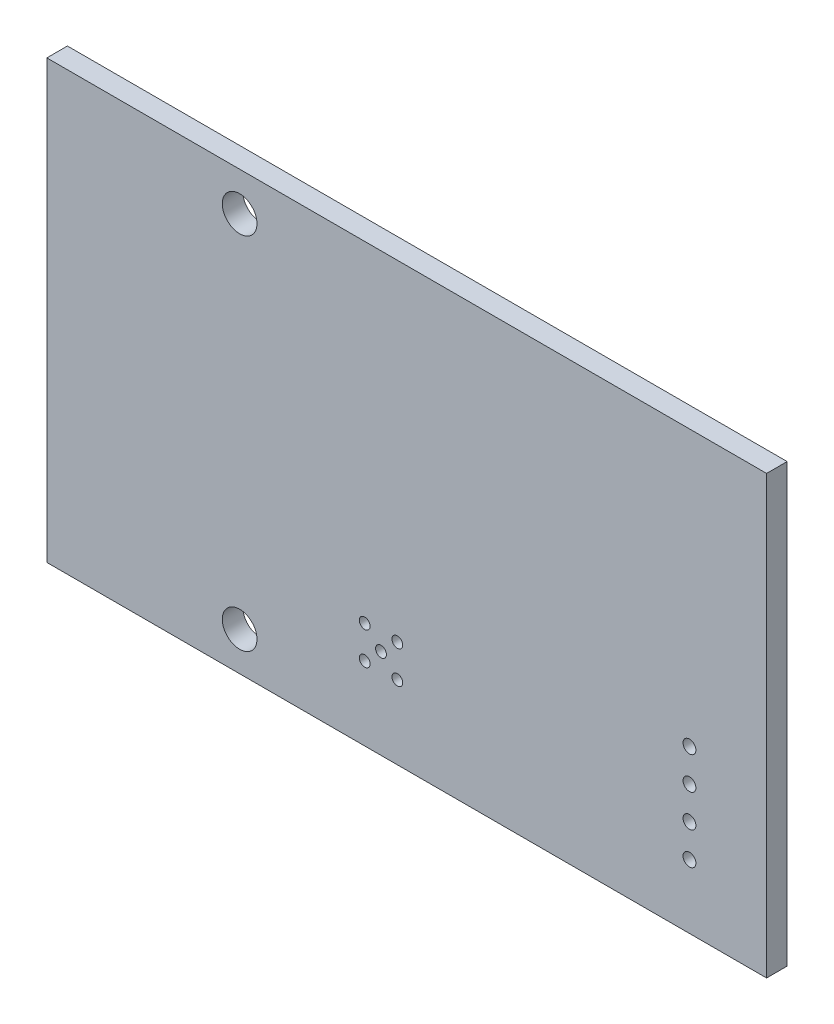
ISO-10303-21;
HEADER;
FILE_DESCRIPTION(('STEP AP214'),'2;1');
FILE_NAME('part.step','',(''),(''),'','','');
FILE_SCHEMA(('AUTOMOTIVE_DESIGN { 1 0 10303 214 1 1 1 1 }'));
ENDSEC;
DATA;
#1=APPLICATION_CONTEXT('core data for automotive mechanical design processes');
#2=APPLICATION_PROTOCOL_DEFINITION('international standard','automotive_design',2000,#1);
#3=PRODUCT_CONTEXT('',#1,'mechanical');
#4=PRODUCT('Part','Part','',(#3));
#5=PRODUCT_RELATED_PRODUCT_CATEGORY('part','',(#4));
#6=PRODUCT_DEFINITION_FORMATION('','',#4);
#7=PRODUCT_DEFINITION_CONTEXT('part definition',#1,'design');
#8=PRODUCT_DEFINITION('design','',#6,#7);
#9=PRODUCT_DEFINITION_SHAPE('','',#8);
#10=(LENGTH_UNIT() NAMED_UNIT(*) SI_UNIT(.MILLI.,.METRE.));
#11=(NAMED_UNIT(*) PLANE_ANGLE_UNIT() SI_UNIT($,.RADIAN.));
#12=(NAMED_UNIT(*) SI_UNIT($,.STERADIAN.) SOLID_ANGLE_UNIT());
#13=UNCERTAINTY_MEASURE_WITH_UNIT(LENGTH_MEASURE(1.E-05),#10,'distance_accuracy_value','');
#14=(GEOMETRIC_REPRESENTATION_CONTEXT(3) GLOBAL_UNCERTAINTY_ASSIGNED_CONTEXT((#13)) GLOBAL_UNIT_ASSIGNED_CONTEXT((#10,
#11,#12)) REPRESENTATION_CONTEXT('',''));
#15=CARTESIAN_POINT('',(0.,0.,0.));
#16=DIRECTION('',(0.,0.,1.));
#17=DIRECTION('',(1.,0.,0.));
#18=AXIS2_PLACEMENT_3D('',#15,#16,#17);
#19=CARTESIAN_POINT('',(103.,-63.,-0.8));
#20=DIRECTION('',(0.,0.,1.));
#21=DIRECTION('',(1.,0.,0.));
#22=AXIS2_PLACEMENT_3D('',#19,#20,#21);
#23=CYLINDRICAL_SURFACE('',#22,1.35);
#24=DIRECTION('',(0.,0.,1.));
#25=VECTOR('',#24,1.);
#26=CARTESIAN_POINT('',(104.35,-63.,-0.8));
#27=LINE('',#26,#25);
#28=CARTESIAN_POINT('',(104.35,-63.,0.));
#29=VERTEX_POINT('',#28);
#30=CARTESIAN_POINT('',(104.35,-63.,1.6));
#31=VERTEX_POINT('',#30);
#32=EDGE_CURVE('E11',#29,#31,#27,.T.);
#33=ORIENTED_EDGE('',*,*,#32,.F.);
#34=CARTESIAN_POINT('',(103.,-63.,0.));
#35=DIRECTION('',(0.,0.,1.));
#36=DIRECTION('',(1.,0.,0.));
#37=AXIS2_PLACEMENT_3D('',#34,#35,#36);
#38=CIRCLE('',#37,1.35);
#39=EDGE_CURVE('E218',#29,#29,#38,.T.);
#40=ORIENTED_EDGE('',*,*,#39,.F.);
#41=ORIENTED_EDGE('',*,*,#32,.T.);
#42=CARTESIAN_POINT('',(103.,-63.,1.6));
#43=DIRECTION('',(0.,0.,1.));
#44=DIRECTION('',(1.,0.,0.));
#45=AXIS2_PLACEMENT_3D('',#42,#43,#44);
#46=CIRCLE('',#45,1.35);
#47=EDGE_CURVE('E312',#31,#31,#46,.T.);
#48=ORIENTED_EDGE('',*,*,#47,.T.);
#49=EDGE_LOOP('',(#33,#40,#41,#48));
#50=FACE_BOUND('',#49,.T.);
#51=ADVANCED_FACE('F16',(#50),#23,.F.);
#52=CARTESIAN_POINT('',(138.,-81.4,-0.8));
#53=DIRECTION('',(0.,0.,1.));
#54=DIRECTION('',(1.,0.,0.));
#55=AXIS2_PLACEMENT_3D('',#52,#53,#54);
#56=CYLINDRICAL_SURFACE('',#55,0.5);
#57=DIRECTION('',(0.,0.,1.));
#58=VECTOR('',#57,1.);
#59=CARTESIAN_POINT('',(138.5,-81.4,-0.8));
#60=LINE('',#59,#58);
#61=CARTESIAN_POINT('',(138.5,-81.4,0.));
#62=VERTEX_POINT('',#61);
#63=CARTESIAN_POINT('',(138.5,-81.4,1.6));
#64=VERTEX_POINT('',#63);
#65=EDGE_CURVE('E27',#62,#64,#60,.T.);
#66=ORIENTED_EDGE('',*,*,#65,.F.);
#67=CARTESIAN_POINT('',(138.,-81.4,0.));
#68=DIRECTION('',(0.,0.,1.));
#69=DIRECTION('',(1.,0.,0.));
#70=AXIS2_PLACEMENT_3D('',#67,#68,#69);
#71=CIRCLE('',#70,0.5);
#72=EDGE_CURVE('E222',#62,#62,#71,.T.);
#73=ORIENTED_EDGE('',*,*,#72,.F.);
#74=ORIENTED_EDGE('',*,*,#65,.T.);
#75=CARTESIAN_POINT('',(138.,-81.4,1.6));
#76=DIRECTION('',(0.,0.,1.));
#77=DIRECTION('',(1.,0.,0.));
#78=AXIS2_PLACEMENT_3D('',#75,#76,#77);
#79=CIRCLE('',#78,0.5);
#80=EDGE_CURVE('E246',#64,#64,#79,.T.);
#81=ORIENTED_EDGE('',*,*,#80,.T.);
#82=EDGE_LOOP('',(#66,#73,#74,#81));
#83=FACE_BOUND('',#82,.T.);
#84=ADVANCED_FACE('F321',(#83),#56,.F.);
#85=CARTESIAN_POINT('',(138.,-83.94,-0.8));
#86=DIRECTION('',(0.,0.,1.));
#87=DIRECTION('',(1.,0.,0.));
#88=AXIS2_PLACEMENT_3D('',#85,#86,#87);
#89=CYLINDRICAL_SURFACE('',#88,0.5);
#90=DIRECTION('',(0.,0.,1.));
#91=VECTOR('',#90,1.);
#92=CARTESIAN_POINT('',(138.5,-83.94,-0.8));
#93=LINE('',#92,#91);
#94=CARTESIAN_POINT('',(138.5,-83.94,0.));
#95=VERTEX_POINT('',#94);
#96=CARTESIAN_POINT('',(138.5,-83.94,1.6));
#97=VERTEX_POINT('',#96);
#98=EDGE_CURVE('E178',#95,#97,#93,.T.);
#99=ORIENTED_EDGE('',*,*,#98,.F.);
#100=CARTESIAN_POINT('',(138.,-83.94,0.));
#101=DIRECTION('',(0.,0.,1.));
#102=DIRECTION('',(1.,0.,0.));
#103=AXIS2_PLACEMENT_3D('',#100,#101,#102);
#104=CIRCLE('',#103,0.5);
#105=EDGE_CURVE('E217',#95,#95,#104,.T.);
#106=ORIENTED_EDGE('',*,*,#105,.F.);
#107=ORIENTED_EDGE('',*,*,#98,.T.);
#108=CARTESIAN_POINT('',(138.,-83.94,1.6));
#109=DIRECTION('',(0.,0.,1.));
#110=DIRECTION('',(1.,0.,0.));
#111=AXIS2_PLACEMENT_3D('',#108,#109,#110);
#112=CIRCLE('',#111,0.5);
#113=EDGE_CURVE('E184',#97,#97,#112,.T.);
#114=ORIENTED_EDGE('',*,*,#113,.T.);
#115=EDGE_LOOP('',(#99,#106,#107,#114));
#116=FACE_BOUND('',#115,.T.);
#117=ADVANCED_FACE('F380',(#116),#89,.F.);
#118=CARTESIAN_POINT('',(138.,-86.48,-0.8));
#119=DIRECTION('',(0.,0.,1.));
#120=DIRECTION('',(1.,0.,0.));
#121=AXIS2_PLACEMENT_3D('',#118,#119,#120);
#122=CYLINDRICAL_SURFACE('',#121,0.5);
#123=DIRECTION('',(0.,0.,1.));
#124=VECTOR('',#123,1.);
#125=CARTESIAN_POINT('',(138.5,-86.48,-0.8));
#126=LINE('',#125,#124);
#127=CARTESIAN_POINT('',(138.5,-86.48,0.));
#128=VERTEX_POINT('',#127);
#129=CARTESIAN_POINT('',(138.5,-86.48,1.6));
#130=VERTEX_POINT('',#129);
#131=EDGE_CURVE('E20',#128,#130,#126,.T.);
#132=ORIENTED_EDGE('',*,*,#131,.F.);
#133=CARTESIAN_POINT('',(138.,-86.48,0.));
#134=DIRECTION('',(0.,0.,1.));
#135=DIRECTION('',(1.,0.,0.));
#136=AXIS2_PLACEMENT_3D('',#133,#134,#135);
#137=CIRCLE('',#136,0.5);
#138=EDGE_CURVE('E213',#128,#128,#137,.T.);
#139=ORIENTED_EDGE('',*,*,#138,.F.);
#140=ORIENTED_EDGE('',*,*,#131,.T.);
#141=CARTESIAN_POINT('',(138.,-86.48,1.6));
#142=DIRECTION('',(0.,0.,1.));
#143=DIRECTION('',(1.,0.,0.));
#144=AXIS2_PLACEMENT_3D('',#141,#142,#143);
#145=CIRCLE('',#144,0.5);
#146=EDGE_CURVE('E180',#130,#130,#145,.T.);
#147=ORIENTED_EDGE('',*,*,#146,.T.);
#148=EDGE_LOOP('',(#132,#139,#140,#147));
#149=FACE_BOUND('',#148,.T.);
#150=ADVANCED_FACE('F390',(#149),#122,.F.);
#151=CARTESIAN_POINT('',(138.,-89.02,-0.8));
#152=DIRECTION('',(0.,0.,1.));
#153=DIRECTION('',(1.,0.,0.));
#154=AXIS2_PLACEMENT_3D('',#151,#152,#153);
#155=CYLINDRICAL_SURFACE('',#154,0.5);
#156=DIRECTION('',(0.,0.,1.));
#157=VECTOR('',#156,1.);
#158=CARTESIAN_POINT('',(138.5,-89.02,-0.8));
#159=LINE('',#158,#157);
#160=CARTESIAN_POINT('',(138.5,-89.02,0.));
#161=VERTEX_POINT('',#160);
#162=CARTESIAN_POINT('',(138.5,-89.02,1.6));
#163=VERTEX_POINT('',#162);
#164=EDGE_CURVE('E163',#161,#163,#159,.T.);
#165=ORIENTED_EDGE('',*,*,#164,.F.);
#166=CARTESIAN_POINT('',(138.,-89.02,0.));
#167=DIRECTION('',(0.,0.,1.));
#168=DIRECTION('',(1.,0.,0.));
#169=AXIS2_PLACEMENT_3D('',#166,#167,#168);
#170=CIRCLE('',#169,0.5);
#171=EDGE_CURVE('E209',#161,#161,#170,.T.);
#172=ORIENTED_EDGE('',*,*,#171,.F.);
#173=ORIENTED_EDGE('',*,*,#164,.T.);
#174=CARTESIAN_POINT('',(138.,-89.02,1.6));
#175=DIRECTION('',(0.,0.,1.));
#176=DIRECTION('',(1.,0.,0.));
#177=AXIS2_PLACEMENT_3D('',#174,#175,#176);
#178=CIRCLE('',#177,0.5);
#179=EDGE_CURVE('E185',#163,#163,#178,.T.);
#180=ORIENTED_EDGE('',*,*,#179,.T.);
#181=EDGE_LOOP('',(#165,#172,#173,#180));
#182=FACE_BOUND('',#181,.T.);
#183=ADVANCED_FACE('F388',(#182),#155,.F.);
#184=CARTESIAN_POINT('',(115.27,-85.73,-0.8));
#185=DIRECTION('',(0.,0.,1.));
#186=DIRECTION('',(1.,0.,0.));
#187=AXIS2_PLACEMENT_3D('',#184,#185,#186);
#188=CYLINDRICAL_SURFACE('',#187,0.42);
#189=DIRECTION('',(0.,0.,1.));
#190=VECTOR('',#189,1.);
#191=CARTESIAN_POINT('',(115.69,-85.73,-0.8));
#192=LINE('',#191,#190);
#193=CARTESIAN_POINT('',(115.69,-85.73,0.));
#194=VERTEX_POINT('',#193);
#195=CARTESIAN_POINT('',(115.69,-85.73,1.6));
#196=VERTEX_POINT('',#195);
#197=EDGE_CURVE('E156',#194,#196,#192,.T.);
#198=ORIENTED_EDGE('',*,*,#197,.F.);
#199=CARTESIAN_POINT('',(115.27,-85.73,0.));
#200=DIRECTION('',(0.,0.,1.));
#201=DIRECTION('',(1.,0.,0.));
#202=AXIS2_PLACEMENT_3D('',#199,#200,#201);
#203=CIRCLE('',#202,0.42);
#204=EDGE_CURVE('E161',#194,#194,#203,.T.);
#205=ORIENTED_EDGE('',*,*,#204,.F.);
#206=ORIENTED_EDGE('',*,*,#197,.T.);
#207=CARTESIAN_POINT('',(115.27,-85.73,1.6));
#208=DIRECTION('',(0.,0.,1.));
#209=DIRECTION('',(1.,0.,0.));
#210=AXIS2_PLACEMENT_3D('',#207,#208,#209);
#211=CIRCLE('',#210,0.42);
#212=EDGE_CURVE('E159',#196,#196,#211,.T.);
#213=ORIENTED_EDGE('',*,*,#212,.T.);
#214=EDGE_LOOP('',(#198,#205,#206,#213));
#215=FACE_BOUND('',#214,.T.);
#216=ADVANCED_FACE('F157',(#215),#188,.F.);
#217=CARTESIAN_POINT('',(112.73,-85.73,-0.8));
#218=DIRECTION('',(0.,0.,1.));
#219=DIRECTION('',(1.,0.,0.));
#220=AXIS2_PLACEMENT_3D('',#217,#218,#219);
#221=CYLINDRICAL_SURFACE('',#220,0.42);
#222=DIRECTION('',(0.,0.,1.));
#223=VECTOR('',#222,1.);
#224=CARTESIAN_POINT('',(113.15,-85.73,-0.8));
#225=LINE('',#224,#223);
#226=CARTESIAN_POINT('',(113.15,-85.73,0.));
#227=VERTEX_POINT('',#226);
#228=CARTESIAN_POINT('',(113.15,-85.73,1.6));
#229=VERTEX_POINT('',#228);
#230=EDGE_CURVE('E164',#227,#229,#225,.T.);
#231=ORIENTED_EDGE('',*,*,#230,.F.);
#232=CARTESIAN_POINT('',(112.73,-85.73,0.));
#233=DIRECTION('',(0.,0.,1.));
#234=DIRECTION('',(1.,0.,0.));
#235=AXIS2_PLACEMENT_3D('',#232,#233,#234);
#236=CIRCLE('',#235,0.42);
#237=EDGE_CURVE('E226',#227,#227,#236,.T.);
#238=ORIENTED_EDGE('',*,*,#237,.F.);
#239=ORIENTED_EDGE('',*,*,#230,.T.);
#240=CARTESIAN_POINT('',(112.73,-85.73,1.6));
#241=DIRECTION('',(0.,0.,1.));
#242=DIRECTION('',(1.,0.,0.));
#243=AXIS2_PLACEMENT_3D('',#240,#241,#242);
#244=CIRCLE('',#243,0.42);
#245=EDGE_CURVE('E263',#229,#229,#244,.T.);
#246=ORIENTED_EDGE('',*,*,#245,.T.);
#247=EDGE_LOOP('',(#231,#238,#239,#246));
#248=FACE_BOUND('',#247,.T.);
#249=ADVANCED_FACE('F387',(#248),#221,.F.);
#250=CARTESIAN_POINT('',(114.,-87.,-0.8));
#251=DIRECTION('',(0.,0.,1.));
#252=DIRECTION('',(1.,0.,0.));
#253=AXIS2_PLACEMENT_3D('',#250,#251,#252);
#254=CYLINDRICAL_SURFACE('',#253,0.42);
#255=DIRECTION('',(0.,0.,1.));
#256=VECTOR('',#255,1.);
#257=CARTESIAN_POINT('',(114.42,-87.,-0.8));
#258=LINE('',#257,#256);
#259=CARTESIAN_POINT('',(114.42,-87.,0.));
#260=VERTEX_POINT('',#259);
#261=CARTESIAN_POINT('',(114.42,-87.,1.6));
#262=VERTEX_POINT('',#261);
#263=EDGE_CURVE('E172',#260,#262,#258,.T.);
#264=ORIENTED_EDGE('',*,*,#263,.F.);
#265=CARTESIAN_POINT('',(114.,-87.,0.));
#266=DIRECTION('',(0.,0.,1.));
#267=DIRECTION('',(1.,0.,0.));
#268=AXIS2_PLACEMENT_3D('',#265,#266,#267);
#269=CIRCLE('',#268,0.42);
#270=EDGE_CURVE('E223',#260,#260,#269,.T.);
#271=ORIENTED_EDGE('',*,*,#270,.F.);
#272=ORIENTED_EDGE('',*,*,#263,.T.);
#273=CARTESIAN_POINT('',(114.,-87.,1.6));
#274=DIRECTION('',(0.,0.,1.));
#275=DIRECTION('',(1.,0.,0.));
#276=AXIS2_PLACEMENT_3D('',#273,#274,#275);
#277=CIRCLE('',#276,0.42);
#278=EDGE_CURVE('E289',#262,#262,#277,.T.);
#279=ORIENTED_EDGE('',*,*,#278,.T.);
#280=EDGE_LOOP('',(#264,#271,#272,#279));
#281=FACE_BOUND('',#280,.T.);
#282=ADVANCED_FACE('F422',(#281),#254,.F.);
#283=CARTESIAN_POINT('',(115.27,-88.27,-0.8));
#284=DIRECTION('',(0.,0.,1.));
#285=DIRECTION('',(1.,0.,0.));
#286=AXIS2_PLACEMENT_3D('',#283,#284,#285);
#287=CYLINDRICAL_SURFACE('',#286,0.42);
#288=DIRECTION('',(0.,0.,1.));
#289=VECTOR('',#288,1.);
#290=CARTESIAN_POINT('',(115.69,-88.27,-0.8));
#291=LINE('',#290,#289);
#292=CARTESIAN_POINT('',(115.69,-88.27,0.));
#293=VERTEX_POINT('',#292);
#294=CARTESIAN_POINT('',(115.69,-88.27,1.6));
#295=VERTEX_POINT('',#294);
#296=EDGE_CURVE('E228',#293,#295,#291,.T.);
#297=ORIENTED_EDGE('',*,*,#296,.F.);
#298=CARTESIAN_POINT('',(115.27,-88.27,0.));
#299=DIRECTION('',(0.,0.,1.));
#300=DIRECTION('',(1.,0.,0.));
#301=AXIS2_PLACEMENT_3D('',#298,#299,#300);
#302=CIRCLE('',#301,0.42);
#303=EDGE_CURVE('E189',#293,#293,#302,.T.);
#304=ORIENTED_EDGE('',*,*,#303,.F.);
#305=ORIENTED_EDGE('',*,*,#296,.T.);
#306=CARTESIAN_POINT('',(115.27,-88.27,1.6));
#307=DIRECTION('',(0.,0.,1.));
#308=DIRECTION('',(1.,0.,0.));
#309=AXIS2_PLACEMENT_3D('',#306,#307,#308);
#310=CIRCLE('',#309,0.42);
#311=EDGE_CURVE('E200',#295,#295,#310,.T.);
#312=ORIENTED_EDGE('',*,*,#311,.T.);
#313=EDGE_LOOP('',(#297,#304,#305,#312));
#314=FACE_BOUND('',#313,.T.);
#315=ADVANCED_FACE('F416',(#314),#287,.F.);
#316=CARTESIAN_POINT('',(112.73,-88.27,-0.8));
#317=DIRECTION('',(0.,0.,1.));
#318=DIRECTION('',(1.,0.,0.));
#319=AXIS2_PLACEMENT_3D('',#316,#317,#318);
#320=CYLINDRICAL_SURFACE('',#319,0.42);
#321=DIRECTION('',(0.,0.,1.));
#322=VECTOR('',#321,1.);
#323=CARTESIAN_POINT('',(113.15,-88.27,-0.8));
#324=LINE('',#323,#322);
#325=CARTESIAN_POINT('',(113.15,-88.27,0.));
#326=VERTEX_POINT('',#325);
#327=CARTESIAN_POINT('',(113.15,-88.27,1.6));
#328=VERTEX_POINT('',#327);
#329=EDGE_CURVE('E235',#326,#328,#324,.T.);
#330=ORIENTED_EDGE('',*,*,#329,.F.);
#331=CARTESIAN_POINT('',(112.73,-88.27,0.));
#332=DIRECTION('',(0.,0.,1.));
#333=DIRECTION('',(1.,0.,0.));
#334=AXIS2_PLACEMENT_3D('',#331,#332,#333);
#335=CIRCLE('',#334,0.42);
#336=EDGE_CURVE('E186',#326,#326,#335,.T.);
#337=ORIENTED_EDGE('',*,*,#336,.F.);
#338=ORIENTED_EDGE('',*,*,#329,.T.);
#339=CARTESIAN_POINT('',(112.73,-88.27,1.6));
#340=DIRECTION('',(0.,0.,1.));
#341=DIRECTION('',(1.,0.,0.));
#342=AXIS2_PLACEMENT_3D('',#339,#340,#341);
#343=CIRCLE('',#342,0.42);
#344=EDGE_CURVE('E196',#328,#328,#343,.T.);
#345=ORIENTED_EDGE('',*,*,#344,.T.);
#346=EDGE_LOOP('',(#330,#337,#338,#345));
#347=FACE_BOUND('',#346,.T.);
#348=ADVANCED_FACE('F410',(#347),#320,.F.);
#349=CARTESIAN_POINT('',(103.,-91.,-0.8));
#350=DIRECTION('',(0.,0.,1.));
#351=DIRECTION('',(1.,0.,0.));
#352=AXIS2_PLACEMENT_3D('',#349,#350,#351);
#353=CYLINDRICAL_SURFACE('',#352,1.35);
#354=DIRECTION('',(0.,0.,1.));
#355=VECTOR('',#354,1.);
#356=CARTESIAN_POINT('',(104.35,-91.,-0.8));
#357=LINE('',#356,#355);
#358=CARTESIAN_POINT('',(104.35,-91.,0.));
#359=VERTEX_POINT('',#358);
#360=CARTESIAN_POINT('',(104.35,-91.,1.6));
#361=VERTEX_POINT('',#360);
#362=EDGE_CURVE('E176',#359,#361,#357,.T.);
#363=ORIENTED_EDGE('',*,*,#362,.F.);
#364=CARTESIAN_POINT('',(103.,-91.,0.));
#365=DIRECTION('',(0.,0.,1.));
#366=DIRECTION('',(1.,0.,0.));
#367=AXIS2_PLACEMENT_3D('',#364,#365,#366);
#368=CIRCLE('',#367,1.35);
#369=EDGE_CURVE('E190',#359,#359,#368,.T.);
#370=ORIENTED_EDGE('',*,*,#369,.F.);
#371=ORIENTED_EDGE('',*,*,#362,.T.);
#372=CARTESIAN_POINT('',(103.,-91.,1.6));
#373=DIRECTION('',(0.,0.,1.));
#374=DIRECTION('',(1.,0.,0.));
#375=AXIS2_PLACEMENT_3D('',#372,#373,#374);
#376=CIRCLE('',#375,1.35);
#377=EDGE_CURVE('E192',#361,#361,#376,.T.);
#378=ORIENTED_EDGE('',*,*,#377,.T.);
#379=EDGE_LOOP('',(#363,#370,#371,#378));
#380=FACE_BOUND('',#379,.T.);
#381=ADVANCED_FACE('F18',(#380),#353,.F.);
#382=CARTESIAN_POINT('',(144.,-60.,0.));
#383=DIRECTION('',(0.,-1.,0.));
#384=DIRECTION('',(0.,0.,-1.));
#385=AXIS2_PLACEMENT_3D('',#382,#383,#384);
#386=PLANE('',#385);
#387=DIRECTION('',(-1.,0.,0.));
#388=VECTOR('',#387,1.);
#389=CARTESIAN_POINT('',(144.,-60.,0.));
#390=LINE('',#389,#388);
#391=CARTESIAN_POINT('',(144.,-60.,0.));
#392=VERTEX_POINT('',#391);
#393=CARTESIAN_POINT('',(88.,-60.,0.));
#394=VERTEX_POINT('',#393);
#395=EDGE_CURVE('E110',#392,#394,#390,.T.);
#396=ORIENTED_EDGE('',*,*,#395,.T.);
#397=DIRECTION('',(0.,0.,1.));
#398=VECTOR('',#397,1.);
#399=CARTESIAN_POINT('',(88.,-60.,0.));
#400=LINE('',#399,#398);
#401=CARTESIAN_POINT('',(88.,-60.,1.6));
#402=VERTEX_POINT('',#401);
#403=EDGE_CURVE('E208',#394,#402,#400,.T.);
#404=ORIENTED_EDGE('',*,*,#403,.T.);
#405=DIRECTION('',(-1.,0.,0.));
#406=VECTOR('',#405,1.);
#407=CARTESIAN_POINT('',(144.,-60.,1.6));
#408=LINE('',#407,#406);
#409=CARTESIAN_POINT('',(144.,-60.,1.6));
#410=VERTEX_POINT('',#409);
#411=EDGE_CURVE('E99',#410,#402,#408,.T.);
#412=ORIENTED_EDGE('',*,*,#411,.F.);
#413=DIRECTION('',(0.,0.,1.));
#414=VECTOR('',#413,1.);
#415=CARTESIAN_POINT('',(144.,-60.,0.));
#416=LINE('',#415,#414);
#417=EDGE_CURVE('E207',#392,#410,#416,.T.);
#418=ORIENTED_EDGE('',*,*,#417,.F.);
#419=EDGE_LOOP('',(#396,#404,#412,#418));
#420=FACE_BOUND('',#419,.T.);
#421=ADVANCED_FACE('F328',(#420),#386,.F.);
#422=CARTESIAN_POINT('',(116.,-77.,1.6));
#423=DIRECTION('',(0.,0.,1.));
#424=DIRECTION('',(1.,0.,0.));
#425=AXIS2_PLACEMENT_3D('',#422,#423,#424);
#426=PLANE('',#425);
#427=ORIENTED_EDGE('',*,*,#47,.F.);
#428=EDGE_LOOP('',(#427));
#429=FACE_BOUND('',#428,.T.);
#430=ORIENTED_EDGE('',*,*,#80,.F.);
#431=EDGE_LOOP('',(#430));
#432=FACE_BOUND('',#431,.T.);
#433=ORIENTED_EDGE('',*,*,#113,.F.);
#434=EDGE_LOOP('',(#433));
#435=FACE_BOUND('',#434,.T.);
#436=ORIENTED_EDGE('',*,*,#146,.F.);
#437=EDGE_LOOP('',(#436));
#438=FACE_BOUND('',#437,.T.);
#439=ORIENTED_EDGE('',*,*,#179,.F.);
#440=EDGE_LOOP('',(#439));
#441=FACE_BOUND('',#440,.T.);
#442=ORIENTED_EDGE('',*,*,#212,.F.);
#443=EDGE_LOOP('',(#442));
#444=FACE_BOUND('',#443,.T.);
#445=ORIENTED_EDGE('',*,*,#245,.F.);
#446=EDGE_LOOP('',(#445));
#447=FACE_BOUND('',#446,.T.);
#448=ORIENTED_EDGE('',*,*,#278,.F.);
#449=EDGE_LOOP('',(#448));
#450=FACE_BOUND('',#449,.T.);
#451=ORIENTED_EDGE('',*,*,#311,.F.);
#452=EDGE_LOOP('',(#451));
#453=FACE_BOUND('',#452,.T.);
#454=ORIENTED_EDGE('',*,*,#344,.F.);
#455=EDGE_LOOP('',(#454));
#456=FACE_BOUND('',#455,.T.);
#457=ORIENTED_EDGE('',*,*,#377,.F.);
#458=EDGE_LOOP('',(#457));
#459=FACE_BOUND('',#458,.T.);
#460=DIRECTION('',(1.,0.,0.));
#461=VECTOR('',#460,1.);
#462=CARTESIAN_POINT('',(88.,-94.,1.6));
#463=LINE('',#462,#461);
#464=CARTESIAN_POINT('',(88.,-94.,1.6));
#465=VERTEX_POINT('',#464);
#466=CARTESIAN_POINT('',(144.,-94.,1.6));
#467=VERTEX_POINT('',#466);
#468=EDGE_CURVE('E265',#465,#467,#463,.T.);
#469=ORIENTED_EDGE('',*,*,#468,.T.);
#470=DIRECTION('',(0.,1.,0.));
#471=VECTOR('',#470,1.);
#472=CARTESIAN_POINT('',(144.,-94.,1.6));
#473=LINE('',#472,#471);
#474=EDGE_CURVE('E255',#467,#410,#473,.T.);
#475=ORIENTED_EDGE('',*,*,#474,.T.);
#476=ORIENTED_EDGE('',*,*,#411,.T.);
#477=DIRECTION('',(0.,-1.,0.));
#478=VECTOR('',#477,1.);
#479=CARTESIAN_POINT('',(88.,-60.,1.6));
#480=LINE('',#479,#478);
#481=EDGE_CURVE('E258',#402,#465,#480,.T.);
#482=ORIENTED_EDGE('',*,*,#481,.T.);
#483=EDGE_LOOP('',(#469,#475,#476,#482));
#484=FACE_BOUND('',#483,.T.);
#485=ADVANCED_FACE('F324',(#429,#432,#435,#438,#441,#444,#447,#450,#453,#456,#459,#484),#426,.T.);
#486=CARTESIAN_POINT('',(116.,-77.,0.));
#487=DIRECTION('',(0.,0.,1.));
#488=DIRECTION('',(1.,0.,0.));
#489=AXIS2_PLACEMENT_3D('',#486,#487,#488);
#490=PLANE('',#489);
#491=ORIENTED_EDGE('',*,*,#39,.T.);
#492=EDGE_LOOP('',(#491));
#493=FACE_BOUND('',#492,.T.);
#494=ORIENTED_EDGE('',*,*,#72,.T.);
#495=EDGE_LOOP('',(#494));
#496=FACE_BOUND('',#495,.T.);
#497=ORIENTED_EDGE('',*,*,#105,.T.);
#498=EDGE_LOOP('',(#497));
#499=FACE_BOUND('',#498,.T.);
#500=ORIENTED_EDGE('',*,*,#138,.T.);
#501=EDGE_LOOP('',(#500));
#502=FACE_BOUND('',#501,.T.);
#503=ORIENTED_EDGE('',*,*,#171,.T.);
#504=EDGE_LOOP('',(#503));
#505=FACE_BOUND('',#504,.T.);
#506=ORIENTED_EDGE('',*,*,#204,.T.);
#507=EDGE_LOOP('',(#506));
#508=FACE_BOUND('',#507,.T.);
#509=ORIENTED_EDGE('',*,*,#237,.T.);
#510=EDGE_LOOP('',(#509));
#511=FACE_BOUND('',#510,.T.);
#512=ORIENTED_EDGE('',*,*,#270,.T.);
#513=EDGE_LOOP('',(#512));
#514=FACE_BOUND('',#513,.T.);
#515=ORIENTED_EDGE('',*,*,#303,.T.);
#516=EDGE_LOOP('',(#515));
#517=FACE_BOUND('',#516,.T.);
#518=ORIENTED_EDGE('',*,*,#336,.T.);
#519=EDGE_LOOP('',(#518));
#520=FACE_BOUND('',#519,.T.);
#521=ORIENTED_EDGE('',*,*,#369,.T.);
#522=EDGE_LOOP('',(#521));
#523=FACE_BOUND('',#522,.T.);
#524=DIRECTION('',(0.,-1.,0.));
#525=VECTOR('',#524,1.);
#526=CARTESIAN_POINT('',(88.,-60.,0.));
#527=LINE('',#526,#525);
#528=CARTESIAN_POINT('',(88.,-94.,0.));
#529=VERTEX_POINT('',#528);
#530=EDGE_CURVE('E282',#394,#529,#527,.T.);
#531=ORIENTED_EDGE('',*,*,#530,.F.);
#532=ORIENTED_EDGE('',*,*,#395,.F.);
#533=DIRECTION('',(0.,1.,0.));
#534=VECTOR('',#533,1.);
#535=CARTESIAN_POINT('',(144.,-94.,0.));
#536=LINE('',#535,#534);
#537=CARTESIAN_POINT('',(144.,-94.,0.));
#538=VERTEX_POINT('',#537);
#539=EDGE_CURVE('E203',#538,#392,#536,.T.);
#540=ORIENTED_EDGE('',*,*,#539,.F.);
#541=DIRECTION('',(1.,0.,0.));
#542=VECTOR('',#541,1.);
#543=CARTESIAN_POINT('',(88.,-94.,0.));
#544=LINE('',#543,#542);
#545=EDGE_CURVE('E297',#529,#538,#544,.T.);
#546=ORIENTED_EDGE('',*,*,#545,.F.);
#547=EDGE_LOOP('',(#531,#532,#540,#546));
#548=FACE_BOUND('',#547,.T.);
#549=ADVANCED_FACE('F327',(#493,#496,#499,#502,#505,#508,#511,#514,#517,#520,#523,#548),#490,.F.);
#550=CARTESIAN_POINT('',(144.,-94.,0.));
#551=DIRECTION('',(-1.,0.,0.));
#552=DIRECTION('',(0.,0.,1.));
#553=AXIS2_PLACEMENT_3D('',#550,#551,#552);
#554=PLANE('',#553);
#555=ORIENTED_EDGE('',*,*,#539,.T.);
#556=ORIENTED_EDGE('',*,*,#417,.T.);
#557=ORIENTED_EDGE('',*,*,#474,.F.);
#558=DIRECTION('',(0.,0.,1.));
#559=VECTOR('',#558,1.);
#560=CARTESIAN_POINT('',(144.,-94.,0.));
#561=LINE('',#560,#559);
#562=EDGE_CURVE('E270',#538,#467,#561,.T.);
#563=ORIENTED_EDGE('',*,*,#562,.F.);
#564=EDGE_LOOP('',(#555,#556,#557,#563));
#565=FACE_BOUND('',#564,.T.);
#566=ADVANCED_FACE('F356',(#565),#554,.F.);
#567=CARTESIAN_POINT('',(88.,-60.,0.));
#568=DIRECTION('',(1.,0.,0.));
#569=DIRECTION('',(0.,1.,0.));
#570=AXIS2_PLACEMENT_3D('',#567,#568,#569);
#571=PLANE('',#570);
#572=ORIENTED_EDGE('',*,*,#530,.T.);
#573=DIRECTION('',(0.,0.,1.));
#574=VECTOR('',#573,1.);
#575=CARTESIAN_POINT('',(88.,-94.,0.));
#576=LINE('',#575,#574);
#577=EDGE_CURVE('E269',#529,#465,#576,.T.);
#578=ORIENTED_EDGE('',*,*,#577,.T.);
#579=ORIENTED_EDGE('',*,*,#481,.F.);
#580=ORIENTED_EDGE('',*,*,#403,.F.);
#581=EDGE_LOOP('',(#572,#578,#579,#580));
#582=FACE_BOUND('',#581,.T.);
#583=ADVANCED_FACE('F364',(#582),#571,.F.);
#584=CARTESIAN_POINT('',(88.,-94.,0.));
#585=DIRECTION('',(0.,1.,0.));
#586=DIRECTION('',(1.,0.,0.));
#587=AXIS2_PLACEMENT_3D('',#584,#585,#586);
#588=PLANE('',#587);
#589=ORIENTED_EDGE('',*,*,#545,.T.);
#590=ORIENTED_EDGE('',*,*,#562,.T.);
#591=ORIENTED_EDGE('',*,*,#468,.F.);
#592=ORIENTED_EDGE('',*,*,#577,.F.);
#593=EDGE_LOOP('',(#589,#590,#591,#592));
#594=FACE_BOUND('',#593,.T.);
#595=ADVANCED_FACE('F353',(#594),#588,.F.);
#596=CLOSED_SHELL('',(#51,#84,#117,#150,#183,#216,#249,#282,#315,#348,#381,#421,#485,#549,#566,
#583,#595));
#597=MANIFOLD_SOLID_BREP('B1',#596);
#598=ADVANCED_BREP_SHAPE_REPRESENTATION('',(#18,#597),#14);
#599=SHAPE_DEFINITION_REPRESENTATION(#9,#598);
ENDSEC;
END-ISO-10303-21;
